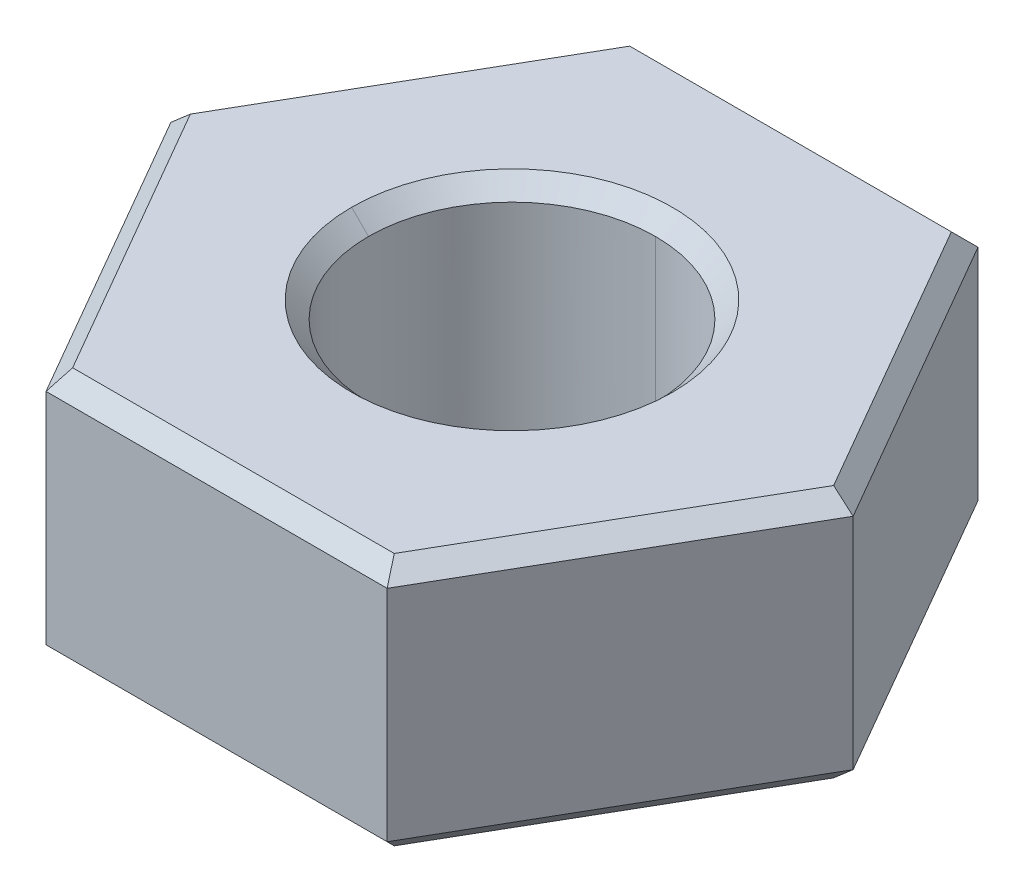
ISO-10303-21;
HEADER;
FILE_DESCRIPTION(('STEP AP214'),'2;1');
FILE_NAME('part.step','',(''),(''),'','','');
FILE_SCHEMA(('AUTOMOTIVE_DESIGN { 1 0 10303 214 1 1 1 1 }'));
ENDSEC;
DATA;
#1=APPLICATION_CONTEXT('core data for automotive mechanical design processes');
#2=APPLICATION_PROTOCOL_DEFINITION('international standard','automotive_design',2000,#1);
#3=PRODUCT_CONTEXT('',#1,'mechanical');
#4=PRODUCT('Part','Part','',(#3));
#5=PRODUCT_RELATED_PRODUCT_CATEGORY('part','',(#4));
#6=PRODUCT_DEFINITION_FORMATION('','',#4);
#7=PRODUCT_DEFINITION_CONTEXT('part definition',#1,'design');
#8=PRODUCT_DEFINITION('design','',#6,#7);
#9=PRODUCT_DEFINITION_SHAPE('','',#8);
#10=(LENGTH_UNIT() NAMED_UNIT(*) SI_UNIT(.MILLI.,.METRE.));
#11=(NAMED_UNIT(*) PLANE_ANGLE_UNIT() SI_UNIT($,.RADIAN.));
#12=(NAMED_UNIT(*) SI_UNIT($,.STERADIAN.) SOLID_ANGLE_UNIT());
#13=UNCERTAINTY_MEASURE_WITH_UNIT(LENGTH_MEASURE(1.E-05),#10,'distance_accuracy_value','');
#14=(GEOMETRIC_REPRESENTATION_CONTEXT(3) GLOBAL_UNCERTAINTY_ASSIGNED_CONTEXT((#13)) GLOBAL_UNIT_ASSIGNED_CONTEXT((#10,
#11,#12)) REPRESENTATION_CONTEXT('',''));
#15=CARTESIAN_POINT('',(0.,0.,0.));
#16=DIRECTION('',(0.,0.,1.));
#17=DIRECTION('',(1.,0.,0.));
#18=AXIS2_PLACEMENT_3D('',#15,#16,#17);
#19=CARTESIAN_POINT('',(4.04145188432738,0.,0.));
#20=DIRECTION('',(0.,1.,0.));
#21=DIRECTION('',(0.,0.,1.));
#22=AXIS2_PLACEMENT_3D('',#19,#20,#21);
#23=PLANE('',#22);
#24=CARTESIAN_POINT('',(0.,0.,0.));
#25=DIRECTION('',(0.,-1.,0.));
#26=DIRECTION('',(0.,0.,-1.));
#27=AXIS2_PLACEMENT_3D('',#24,#25,#26);
#28=CIRCLE('',#27,1.90000000003465);
#29=CARTESIAN_POINT('',(0.,0.,1.90000000003465));
#30=VERTEX_POINT('',#29);
#31=CARTESIAN_POINT('',(0.,0.,-1.90000000003465));
#32=VERTEX_POINT('',#31);
#33=EDGE_CURVE('E46',#30,#32,#28,.F.);
#34=ORIENTED_EDGE('',*,*,#33,.T.);
#35=CARTESIAN_POINT('',(0.,0.,0.));
#36=DIRECTION('',(0.,-1.,0.));
#37=DIRECTION('',(0.,0.,-1.));
#38=AXIS2_PLACEMENT_3D('',#35,#36,#37);
#39=CIRCLE('',#38,1.90000000003465);
#40=EDGE_CURVE('E20',#32,#30,#39,.F.);
#41=ORIENTED_EDGE('',*,*,#40,.T.);
#42=EDGE_LOOP('',(#34,#41));
#43=FACE_BOUND('',#42,.T.);
#44=DIRECTION('',(-0.5,0.,0.866025403784439));
#45=VECTOR('',#44,1.);
#46=CARTESIAN_POINT('',(3.81051177665153,0.,0.));
#47=LINE('',#46,#45);
#48=CARTESIAN_POINT('',(3.81051177665153,0.,0.));
#49=VERTEX_POINT('',#48);
#50=CARTESIAN_POINT('',(1.90525588832576,0.,3.3));
#51=VERTEX_POINT('',#50);
#52=EDGE_CURVE('E225',#49,#51,#47,.T.);
#53=ORIENTED_EDGE('',*,*,#52,.T.);
#54=DIRECTION('',(1.,0.,0.));
#55=VECTOR('',#54,1.);
#56=CARTESIAN_POINT('',(-2.02072594216369,0.,3.3));
#57=LINE('',#56,#55);
#58=CARTESIAN_POINT('',(-1.90525588832576,0.,3.3));
#59=VERTEX_POINT('',#58);
#60=EDGE_CURVE('E230',#51,#59,#57,.F.);
#61=ORIENTED_EDGE('',*,*,#60,.T.);
#62=DIRECTION('',(-0.5,0.,-0.866025403784439));
#63=VECTOR('',#62,1.);
#64=CARTESIAN_POINT('',(-1.90525588832576,0.,3.3));
#65=LINE('',#64,#63);
#66=CARTESIAN_POINT('',(-3.81051177665153,0.,0.));
#67=VERTEX_POINT('',#66);
#68=EDGE_CURVE('E235',#59,#67,#65,.T.);
#69=ORIENTED_EDGE('',*,*,#68,.T.);
#70=DIRECTION('',(0.5,0.,-0.866025403784439));
#71=VECTOR('',#70,1.);
#72=CARTESIAN_POINT('',(-3.81051177665153,0.,0.));
#73=LINE('',#72,#71);
#74=CARTESIAN_POINT('',(-1.90525588832576,0.,-3.3));
#75=VERTEX_POINT('',#74);
#76=EDGE_CURVE('E242',#67,#75,#73,.T.);
#77=ORIENTED_EDGE('',*,*,#76,.T.);
#78=DIRECTION('',(1.,0.,0.));
#79=VECTOR('',#78,1.);
#80=CARTESIAN_POINT('',(2.02072594216369,0.,-3.3));
#81=LINE('',#80,#79);
#82=CARTESIAN_POINT('',(1.90525588832576,0.,-3.3));
#83=VERTEX_POINT('',#82);
#84=EDGE_CURVE('E60',#75,#83,#81,.T.);
#85=ORIENTED_EDGE('',*,*,#84,.T.);
#86=DIRECTION('',(0.5,0.,0.866025403784439));
#87=VECTOR('',#86,1.);
#88=CARTESIAN_POINT('',(1.90525588832576,0.,-3.3));
#89=LINE('',#88,#87);
#90=EDGE_CURVE('E219',#83,#49,#89,.T.);
#91=ORIENTED_EDGE('',*,*,#90,.T.);
#92=EDGE_LOOP('',(#53,#61,#69,#77,#85,#91));
#93=FACE_BOUND('',#92,.T.);
#94=ADVANCED_FACE('F17',(#43,#93),#23,.F.);
#95=CARTESIAN_POINT('',(2.02072594216369,0.200000000000001,-3.5));
#96=DIRECTION('',(0.,0.707106781186551,0.707106781186544));
#97=DIRECTION('',(0.,-0.707106781186544,0.707106781186551));
#98=AXIS2_PLACEMENT_3D('',#95,#96,#97);
#99=PLANE('',#98);
#100=DIRECTION('',(-0.377964473009231,-0.654653670707974,0.654653670707978));
#101=VECTOR('',#100,1.);
#102=CARTESIAN_POINT('',(2.02072594216369,0.2,-3.5));
#103=LINE('',#102,#101);
#104=CARTESIAN_POINT('',(2.02072594216369,0.200000000000001,-3.5));
#105=VERTEX_POINT('',#104);
#106=EDGE_CURVE('E221',#105,#83,#103,.T.);
#107=ORIENTED_EDGE('',*,*,#106,.T.);
#108=ORIENTED_EDGE('',*,*,#84,.F.);
#109=DIRECTION('',(-0.377964473009228,0.654653670707975,-0.654653670707979));
#110=VECTOR('',#109,1.);
#111=CARTESIAN_POINT('',(-1.90525588832576,0.,-3.3));
#112=LINE('',#111,#110);
#113=CARTESIAN_POINT('',(-2.02072594216369,0.2,-3.5));
#114=VERTEX_POINT('',#113);
#115=EDGE_CURVE('E240',#75,#114,#112,.T.);
#116=ORIENTED_EDGE('',*,*,#115,.T.);
#117=DIRECTION('',(1.,0.,0.));
#118=VECTOR('',#117,1.);
#119=CARTESIAN_POINT('',(2.02072594216369,0.200000000000001,-3.5));
#120=LINE('',#119,#118);
#121=EDGE_CURVE('E204',#114,#105,#120,.T.);
#122=ORIENTED_EDGE('',*,*,#121,.T.);
#123=EDGE_LOOP('',(#107,#108,#116,#122));
#124=FACE_BOUND('',#123,.T.);
#125=ADVANCED_FACE('F390',(#124),#99,.F.);
#126=CARTESIAN_POINT('',(-2.02072594216369,0.200000000000001,-3.5));
#127=DIRECTION('',(0.612372435695792,0.70710678118655,0.353553390593272));
#128=DIRECTION('',(-0.755928946018457,0.654653670707974,0.));
#129=AXIS2_PLACEMENT_3D('',#126,#127,#128);
#130=PLANE('',#129);
#131=ORIENTED_EDGE('',*,*,#115,.F.);
#132=ORIENTED_EDGE('',*,*,#76,.F.);
#133=DIRECTION('',(-0.755928946018457,0.654653670707974,0.));
#134=VECTOR('',#133,1.);
#135=CARTESIAN_POINT('',(-4.04145188432738,0.200000000000001,0.));
#136=LINE('',#135,#134);
#137=CARTESIAN_POINT('',(-4.04145188432738,0.200000000000001,0.));
#138=VERTEX_POINT('',#137);
#139=EDGE_CURVE('E238',#67,#138,#136,.T.);
#140=ORIENTED_EDGE('',*,*,#139,.T.);
#141=DIRECTION('',(0.5,0.,-0.866025403784439));
#142=VECTOR('',#141,1.);
#143=CARTESIAN_POINT('',(-2.02072594216369,0.200000000000001,-3.5));
#144=LINE('',#143,#142);
#145=EDGE_CURVE('E200',#138,#114,#144,.T.);
#146=ORIENTED_EDGE('',*,*,#145,.T.);
#147=EDGE_LOOP('',(#131,#132,#140,#146));
#148=FACE_BOUND('',#147,.T.);
#149=ADVANCED_FACE('F391',(#148),#130,.F.);
#150=CARTESIAN_POINT('',(-4.04145188432738,0.200000000000001,0.));
#151=DIRECTION('',(0.612372435695792,0.707106781186551,-0.353553390593272));
#152=DIRECTION('',(-0.755928946018457,0.654653670707974,0.));
#153=AXIS2_PLACEMENT_3D('',#150,#151,#152);
#154=PLANE('',#153);
#155=DIRECTION('',(-0.377964473009229,0.654653670707973,0.65465367070798));
#156=VECTOR('',#155,1.);
#157=CARTESIAN_POINT('',(-1.90525588832576,0.,3.3));
#158=LINE('',#157,#156);
#159=CARTESIAN_POINT('',(-2.02072594216369,0.2,3.5));
#160=VERTEX_POINT('',#159);
#161=EDGE_CURVE('E233',#59,#160,#158,.T.);
#162=ORIENTED_EDGE('',*,*,#161,.T.);
#163=DIRECTION('',(-0.5,0.,-0.866025403784439));
#164=VECTOR('',#163,1.);
#165=CARTESIAN_POINT('',(-4.04145188432738,0.2,0.));
#166=LINE('',#165,#164);
#167=EDGE_CURVE('E195',#160,#138,#166,.T.);
#168=ORIENTED_EDGE('',*,*,#167,.T.);
#169=ORIENTED_EDGE('',*,*,#139,.F.);
#170=ORIENTED_EDGE('',*,*,#68,.F.);
#171=EDGE_LOOP('',(#162,#168,#169,#170));
#172=FACE_BOUND('',#171,.T.);
#173=ADVANCED_FACE('F362',(#172),#154,.F.);
#174=CARTESIAN_POINT('',(-2.02072594216369,0.200000000000001,3.5));
#175=DIRECTION('',(0.,0.707106781186551,-0.707106781186544));
#176=DIRECTION('',(0.,0.707106781186544,0.707106781186551));
#177=AXIS2_PLACEMENT_3D('',#174,#175,#176);
#178=PLANE('',#177);
#179=DIRECTION('',(0.37796447300923,0.654653670707973,0.65465367070798));
#180=VECTOR('',#179,1.);
#181=CARTESIAN_POINT('',(1.90525588832576,0.,3.3));
#182=LINE('',#181,#180);
#183=CARTESIAN_POINT('',(2.02072594216369,0.200000000000001,3.5));
#184=VERTEX_POINT('',#183);
#185=EDGE_CURVE('E228',#51,#184,#182,.T.);
#186=ORIENTED_EDGE('',*,*,#185,.T.);
#187=DIRECTION('',(-1.,0.,0.));
#188=VECTOR('',#187,1.);
#189=CARTESIAN_POINT('',(-2.02072594216369,0.200000000000001,3.5));
#190=LINE('',#189,#188);
#191=EDGE_CURVE('E189',#184,#160,#190,.T.);
#192=ORIENTED_EDGE('',*,*,#191,.T.);
#193=ORIENTED_EDGE('',*,*,#161,.F.);
#194=ORIENTED_EDGE('',*,*,#60,.F.);
#195=EDGE_LOOP('',(#186,#192,#193,#194));
#196=FACE_BOUND('',#195,.T.);
#197=ADVANCED_FACE('F365',(#196),#178,.F.);
#198=CARTESIAN_POINT('',(2.02072594216369,0.200000000000001,3.5));
#199=DIRECTION('',(-0.612372435695791,0.707106781186552,-0.353553390593271));
#200=DIRECTION('',(-0.755928946018458,-0.654653670707973,0.));
#201=AXIS2_PLACEMENT_3D('',#198,#199,#200);
#202=PLANE('',#201);
#203=DIRECTION('',(-0.755928946018458,-0.654653670707974,0.));
#204=VECTOR('',#203,1.);
#205=CARTESIAN_POINT('',(4.04145188432738,0.200000000000001,0.));
#206=LINE('',#205,#204);
#207=CARTESIAN_POINT('',(4.04145188432738,0.200000000000001,0.));
#208=VERTEX_POINT('',#207);
#209=EDGE_CURVE('E223',#49,#208,#206,.F.);
#210=ORIENTED_EDGE('',*,*,#209,.T.);
#211=DIRECTION('',(-0.5,0.,0.866025403784439));
#212=VECTOR('',#211,1.);
#213=CARTESIAN_POINT('',(2.02072594216369,0.200000000000001,3.5));
#214=LINE('',#213,#212);
#215=EDGE_CURVE('E183',#208,#184,#214,.T.);
#216=ORIENTED_EDGE('',*,*,#215,.T.);
#217=ORIENTED_EDGE('',*,*,#185,.F.);
#218=ORIENTED_EDGE('',*,*,#52,.F.);
#219=EDGE_LOOP('',(#210,#216,#217,#218));
#220=FACE_BOUND('',#219,.T.);
#221=ADVANCED_FACE('F369',(#220),#202,.F.);
#222=CARTESIAN_POINT('',(4.04145188432738,0.200000000000001,0.));
#223=DIRECTION('',(-0.612372435695792,0.707106781186551,0.353553390593272));
#224=DIRECTION('',(-0.755928946018458,-0.654653670707974,0.));
#225=AXIS2_PLACEMENT_3D('',#222,#223,#224);
#226=PLANE('',#225);
#227=ORIENTED_EDGE('',*,*,#106,.F.);
#228=DIRECTION('',(0.5,0.,0.866025403784438));
#229=VECTOR('',#228,1.);
#230=CARTESIAN_POINT('',(4.04145188432738,0.200000000000001,0.));
#231=LINE('',#230,#229);
#232=EDGE_CURVE('E173',#105,#208,#231,.T.);
#233=ORIENTED_EDGE('',*,*,#232,.T.);
#234=ORIENTED_EDGE('',*,*,#209,.F.);
#235=ORIENTED_EDGE('',*,*,#90,.F.);
#236=EDGE_LOOP('',(#227,#233,#234,#235));
#237=FACE_BOUND('',#236,.T.);
#238=ADVANCED_FACE('F388',(#237),#226,.F.);
#239=CARTESIAN_POINT('',(0.,0.,0.));
#240=DIRECTION('',(0.,-1.,0.));
#241=DIRECTION('',(0.,0.,-1.));
#242=AXIS2_PLACEMENT_3D('',#239,#240,#241);
#243=CONICAL_SURFACE('',#242,1.90000000003465,0.785398163539557);
#244=DIRECTION('',(0.,0.707106781186548,-0.707106781186547));
#245=VECTOR('',#244,1.);
#246=CARTESIAN_POINT('',(6.11098752774529E-11,-498998.1,499000.));
#247=LINE('',#246,#245);
#248=CARTESIAN_POINT('',(0.,0.200000000001662,1.69999999999279));
#249=VERTEX_POINT('',#248);
#250=EDGE_CURVE('E206',#249,#30,#247,.F.);
#251=ORIENTED_EDGE('',*,*,#250,.T.);
#252=ORIENTED_EDGE('',*,*,#40,.F.);
#253=DIRECTION('',(0.,0.707106781186548,0.707106781186547));
#254=VECTOR('',#253,1.);
#255=CARTESIAN_POINT('',(0.,-498998.1,-499000.));
#256=LINE('',#255,#254);
#257=CARTESIAN_POINT('',(0.,0.200000000001662,-1.69999999999279));
#258=VERTEX_POINT('',#257);
#259=EDGE_CURVE('E87',#32,#258,#256,.T.);
#260=ORIENTED_EDGE('',*,*,#259,.T.);
#261=CARTESIAN_POINT('',(0.,0.200000000000002,0.));
#262=DIRECTION('',(0.,-1.,0.));
#263=DIRECTION('',(0.,0.,-1.));
#264=AXIS2_PLACEMENT_3D('',#261,#262,#263);
#265=CIRCLE('',#264,1.7);
#266=EDGE_CURVE('E176',#258,#249,#265,.F.);
#267=ORIENTED_EDGE('',*,*,#266,.T.);
#268=EDGE_LOOP('',(#251,#252,#260,#267));
#269=FACE_BOUND('',#268,.T.);
#270=ADVANCED_FACE('F410',(#269),#243,.F.);
#271=CARTESIAN_POINT('',(0.,0.,0.));
#272=DIRECTION('',(0.,-1.,0.));
#273=DIRECTION('',(0.,0.,-1.));
#274=AXIS2_PLACEMENT_3D('',#271,#272,#273);
#275=CONICAL_SURFACE('',#274,1.90000000003465,0.785398163539557);
#276=CARTESIAN_POINT('',(0.,0.200000000000002,0.));
#277=DIRECTION('',(0.,-1.,0.));
#278=DIRECTION('',(0.,0.,-1.));
#279=AXIS2_PLACEMENT_3D('',#276,#277,#278);
#280=CIRCLE('',#279,1.7);
#281=EDGE_CURVE('E147',#249,#258,#280,.F.);
#282=ORIENTED_EDGE('',*,*,#281,.T.);
#283=ORIENTED_EDGE('',*,*,#259,.F.);
#284=ORIENTED_EDGE('',*,*,#33,.F.);
#285=ORIENTED_EDGE('',*,*,#250,.F.);
#286=EDGE_LOOP('',(#282,#283,#284,#285));
#287=FACE_BOUND('',#286,.T.);
#288=ADVANCED_FACE('F413',(#287),#275,.F.);
#289=CARTESIAN_POINT('',(2.02072594216369,3.,-3.5));
#290=DIRECTION('',(0.,0.,1.));
#291=DIRECTION('',(1.,0.,0.));
#292=AXIS2_PLACEMENT_3D('',#289,#290,#291);
#293=PLANE('',#292);
#294=DIRECTION('',(0.,1.,0.));
#295=VECTOR('',#294,1.);
#296=CARTESIAN_POINT('',(-2.02072594216369,3.,-3.5));
#297=LINE('',#296,#295);
#298=CARTESIAN_POINT('',(-2.02072594216369,2.8,-3.5));
#299=VERTEX_POINT('',#298);
#300=EDGE_CURVE('E96',#114,#299,#297,.T.);
#301=ORIENTED_EDGE('',*,*,#300,.T.);
#302=DIRECTION('',(1.,0.,0.));
#303=VECTOR('',#302,1.);
#304=CARTESIAN_POINT('',(4.04145188432738,2.8,-3.5));
#305=LINE('',#304,#303);
#306=CARTESIAN_POINT('',(2.02072594216369,2.8,-3.5));
#307=VERTEX_POINT('',#306);
#308=EDGE_CURVE('E148',#307,#299,#305,.F.);
#309=ORIENTED_EDGE('',*,*,#308,.F.);
#310=DIRECTION('',(0.,1.,0.));
#311=VECTOR('',#310,1.);
#312=CARTESIAN_POINT('',(2.02072594216369,3.,-3.5));
#313=LINE('',#312,#311);
#314=EDGE_CURVE('E177',#307,#105,#313,.F.);
#315=ORIENTED_EDGE('',*,*,#314,.T.);
#316=ORIENTED_EDGE('',*,*,#121,.F.);
#317=EDGE_LOOP('',(#301,#309,#315,#316));
#318=FACE_BOUND('',#317,.T.);
#319=ADVANCED_FACE('F384',(#318),#293,.F.);
#320=CARTESIAN_POINT('',(-2.02072594216369,3.,-3.5));
#321=DIRECTION('',(0.866025403784439,0.,0.5));
#322=DIRECTION('',(0.5,0.,-0.866025403784439));
#323=AXIS2_PLACEMENT_3D('',#320,#321,#322);
#324=PLANE('',#323);
#325=DIRECTION('',(0.,1.,0.));
#326=VECTOR('',#325,1.);
#327=CARTESIAN_POINT('',(-4.04145188432738,3.,0.));
#328=LINE('',#327,#326);
#329=CARTESIAN_POINT('',(-4.04145188432738,2.8,0.));
#330=VERTEX_POINT('',#329);
#331=EDGE_CURVE('E198',#138,#330,#328,.T.);
#332=ORIENTED_EDGE('',*,*,#331,.T.);
#333=DIRECTION('',(-0.5,0.,0.866025403784439));
#334=VECTOR('',#333,1.);
#335=CARTESIAN_POINT('',(-2.02072594216369,2.8,-3.5));
#336=LINE('',#335,#334);
#337=EDGE_CURVE('E298',#299,#330,#336,.T.);
#338=ORIENTED_EDGE('',*,*,#337,.F.);
#339=ORIENTED_EDGE('',*,*,#300,.F.);
#340=ORIENTED_EDGE('',*,*,#145,.F.);
#341=EDGE_LOOP('',(#332,#338,#339,#340));
#342=FACE_BOUND('',#341,.T.);
#343=ADVANCED_FACE('F356',(#342),#324,.F.);
#344=CARTESIAN_POINT('',(-4.04145188432738,3.,0.));
#345=DIRECTION('',(0.866025403784439,0.,-0.5));
#346=DIRECTION('',(-0.5,0.,-0.866025403784439));
#347=AXIS2_PLACEMENT_3D('',#344,#345,#346);
#348=PLANE('',#347);
#349=DIRECTION('',(0.,1.,0.));
#350=VECTOR('',#349,1.);
#351=CARTESIAN_POINT('',(-2.02072594216369,3.,3.5));
#352=LINE('',#351,#350);
#353=CARTESIAN_POINT('',(-2.02072594216369,2.8,3.5));
#354=VERTEX_POINT('',#353);
#355=EDGE_CURVE('E192',#160,#354,#352,.T.);
#356=ORIENTED_EDGE('',*,*,#355,.T.);
#357=DIRECTION('',(0.5,0.,0.866025403784438));
#358=VECTOR('',#357,1.);
#359=CARTESIAN_POINT('',(-4.04145188432738,2.8,0.));
#360=LINE('',#359,#358);
#361=EDGE_CURVE('E292',#330,#354,#360,.T.);
#362=ORIENTED_EDGE('',*,*,#361,.F.);
#363=ORIENTED_EDGE('',*,*,#331,.F.);
#364=ORIENTED_EDGE('',*,*,#167,.F.);
#365=EDGE_LOOP('',(#356,#362,#363,#364));
#366=FACE_BOUND('',#365,.T.);
#367=ADVANCED_FACE('F339',(#366),#348,.F.);
#368=CARTESIAN_POINT('',(-2.02072594216369,3.,3.5));
#369=DIRECTION('',(0.,0.,-1.));
#370=DIRECTION('',(-1.,0.,0.));
#371=AXIS2_PLACEMENT_3D('',#368,#369,#370);
#372=PLANE('',#371);
#373=DIRECTION('',(0.,1.,0.));
#374=VECTOR('',#373,1.);
#375=CARTESIAN_POINT('',(2.02072594216369,3.,3.5));
#376=LINE('',#375,#374);
#377=CARTESIAN_POINT('',(2.02072594216369,2.8,3.5));
#378=VERTEX_POINT('',#377);
#379=EDGE_CURVE('E186',#184,#378,#376,.T.);
#380=ORIENTED_EDGE('',*,*,#379,.T.);
#381=DIRECTION('',(1.,0.,0.));
#382=VECTOR('',#381,1.);
#383=CARTESIAN_POINT('',(4.04145188432738,2.8,3.5));
#384=LINE('',#383,#382);
#385=EDGE_CURVE('E286',#354,#378,#384,.T.);
#386=ORIENTED_EDGE('',*,*,#385,.F.);
#387=ORIENTED_EDGE('',*,*,#355,.F.);
#388=ORIENTED_EDGE('',*,*,#191,.F.);
#389=EDGE_LOOP('',(#380,#386,#387,#388));
#390=FACE_BOUND('',#389,.T.);
#391=ADVANCED_FACE('F347',(#390),#372,.F.);
#392=CARTESIAN_POINT('',(2.02072594216369,3.,3.5));
#393=DIRECTION('',(-0.866025403784439,0.,-0.5));
#394=DIRECTION('',(-0.5,0.,0.866025403784439));
#395=AXIS2_PLACEMENT_3D('',#392,#393,#394);
#396=PLANE('',#395);
#397=DIRECTION('',(0.,1.,0.));
#398=VECTOR('',#397,1.);
#399=CARTESIAN_POINT('',(4.04145188432738,3.,0.));
#400=LINE('',#399,#398);
#401=CARTESIAN_POINT('',(4.04145188432738,2.8,0.));
#402=VERTEX_POINT('',#401);
#403=EDGE_CURVE('E180',#208,#402,#400,.T.);
#404=ORIENTED_EDGE('',*,*,#403,.T.);
#405=DIRECTION('',(0.5,0.,-0.866025403784439));
#406=VECTOR('',#405,1.);
#407=CARTESIAN_POINT('',(2.02072594216369,2.8,3.5));
#408=LINE('',#407,#406);
#409=EDGE_CURVE('E280',#378,#402,#408,.T.);
#410=ORIENTED_EDGE('',*,*,#409,.F.);
#411=ORIENTED_EDGE('',*,*,#379,.F.);
#412=ORIENTED_EDGE('',*,*,#215,.F.);
#413=EDGE_LOOP('',(#404,#410,#411,#412));
#414=FACE_BOUND('',#413,.T.);
#415=ADVANCED_FACE('F372',(#414),#396,.F.);
#416=CARTESIAN_POINT('',(4.04145188432738,3.,0.));
#417=DIRECTION('',(-0.866025403784438,0.,0.5));
#418=DIRECTION('',(0.5,0.,0.866025403784438));
#419=AXIS2_PLACEMENT_3D('',#416,#417,#418);
#420=PLANE('',#419);
#421=ORIENTED_EDGE('',*,*,#314,.F.);
#422=DIRECTION('',(-0.5,0.,-0.866025403784438));
#423=VECTOR('',#422,1.);
#424=CARTESIAN_POINT('',(4.04145188432738,2.8,0.));
#425=LINE('',#424,#423);
#426=EDGE_CURVE('E274',#402,#307,#425,.T.);
#427=ORIENTED_EDGE('',*,*,#426,.F.);
#428=ORIENTED_EDGE('',*,*,#403,.F.);
#429=ORIENTED_EDGE('',*,*,#232,.F.);
#430=EDGE_LOOP('',(#421,#427,#428,#429));
#431=FACE_BOUND('',#430,.T.);
#432=ADVANCED_FACE('F377',(#431),#420,.F.);
#433=CARTESIAN_POINT('',(0.,3.,0.));
#434=DIRECTION('',(0.,-1.,0.));
#435=DIRECTION('',(0.,0.,-1.));
#436=AXIS2_PLACEMENT_3D('',#433,#434,#435);
#437=CYLINDRICAL_SURFACE('',#436,1.7);
#438=CARTESIAN_POINT('',(0.,2.80000000003611,0.));
#439=DIRECTION('',(0.,1.,0.));
#440=DIRECTION('',(-1.,0.,0.));
#441=AXIS2_PLACEMENT_3D('',#438,#439,#440);
#442=CIRCLE('',#441,1.70000000002801);
#443=CARTESIAN_POINT('',(-1.70000000002801,2.80000000003611,0.));
#444=VERTEX_POINT('',#443);
#445=CARTESIAN_POINT('',(0.,2.80000000003611,1.70000000001868));
#446=VERTEX_POINT('',#445);
#447=EDGE_CURVE('E127',#444,#446,#442,.T.);
#448=ORIENTED_EDGE('',*,*,#447,.T.);
#449=DIRECTION('',(0.,-1.,0.));
#450=VECTOR('',#449,1.);
#451=CARTESIAN_POINT('',(0.,3.,1.7));
#452=LINE('',#451,#450);
#453=EDGE_CURVE('E131',#446,#249,#452,.T.);
#454=ORIENTED_EDGE('',*,*,#453,.T.);
#455=ORIENTED_EDGE('',*,*,#266,.F.);
#456=DIRECTION('',(0.,-1.,0.));
#457=VECTOR('',#456,1.);
#458=CARTESIAN_POINT('',(0.,3.,-1.7));
#459=LINE('',#458,#457);
#460=CARTESIAN_POINT('',(0.,2.80000000003611,-1.70000000001868));
#461=VERTEX_POINT('',#460);
#462=EDGE_CURVE('E149',#258,#461,#459,.F.);
#463=ORIENTED_EDGE('',*,*,#462,.T.);
#464=CARTESIAN_POINT('',(0.,2.80000000003611,0.));
#465=DIRECTION('',(0.,1.,0.));
#466=DIRECTION('',(-1.,0.,0.));
#467=AXIS2_PLACEMENT_3D('',#464,#465,#466);
#468=CIRCLE('',#467,1.70000000002801);
#469=EDGE_CURVE('E135',#461,#444,#468,.T.);
#470=ORIENTED_EDGE('',*,*,#469,.T.);
#471=EDGE_LOOP('',(#448,#454,#455,#463,#470));
#472=FACE_BOUND('',#471,.T.);
#473=ADVANCED_FACE('F129',(#472),#437,.F.);
#474=CARTESIAN_POINT('',(0.,3.,0.));
#475=DIRECTION('',(0.,-1.,0.));
#476=DIRECTION('',(0.,0.,-1.));
#477=AXIS2_PLACEMENT_3D('',#474,#475,#476);
#478=CYLINDRICAL_SURFACE('',#477,1.7);
#479=CARTESIAN_POINT('',(0.,2.80000000003611,0.));
#480=DIRECTION('',(0.,1.,0.));
#481=DIRECTION('',(-1.,0.,0.));
#482=AXIS2_PLACEMENT_3D('',#479,#480,#481);
#483=CIRCLE('',#482,1.70000000002801);
#484=CARTESIAN_POINT('',(1.70000000006591,2.80000000005505,0.));
#485=VERTEX_POINT('',#484);
#486=EDGE_CURVE('E140',#446,#485,#483,.T.);
#487=ORIENTED_EDGE('',*,*,#486,.T.);
#488=CARTESIAN_POINT('',(0.,2.80000000003611,0.));
#489=DIRECTION('',(0.,1.,0.));
#490=DIRECTION('',(-1.,0.,0.));
#491=AXIS2_PLACEMENT_3D('',#488,#489,#490);
#492=CIRCLE('',#491,1.70000000002801);
#493=EDGE_CURVE('E166',#485,#461,#492,.T.);
#494=ORIENTED_EDGE('',*,*,#493,.T.);
#495=ORIENTED_EDGE('',*,*,#462,.F.);
#496=ORIENTED_EDGE('',*,*,#281,.F.);
#497=ORIENTED_EDGE('',*,*,#453,.F.);
#498=EDGE_LOOP('',(#487,#494,#495,#496,#497));
#499=FACE_BOUND('',#498,.T.);
#500=ADVANCED_FACE('F144',(#499),#478,.F.);
#501=CARTESIAN_POINT('',(4.04145188432738,3.,-3.3));
#502=DIRECTION('',(0.,0.707106781186545,-0.70710678118655));
#503=DIRECTION('',(0.,0.70710678118655,0.707106781186545));
#504=AXIS2_PLACEMENT_3D('',#501,#502,#503);
#505=PLANE('',#504);
#506=DIRECTION('',(-0.377964473009227,0.65465367070798,0.654653670707974));
#507=VECTOR('',#506,1.);
#508=CARTESIAN_POINT('',(2.02072594216369,2.8,-3.5));
#509=LINE('',#508,#507);
#510=CARTESIAN_POINT('',(1.90525588832577,3.,-3.3));
#511=VERTEX_POINT('',#510);
#512=EDGE_CURVE('E167',#307,#511,#509,.T.);
#513=ORIENTED_EDGE('',*,*,#512,.F.);
#514=ORIENTED_EDGE('',*,*,#308,.T.);
#515=DIRECTION('',(-0.377964473009223,-0.654653670707979,-0.654653670707978));
#516=VECTOR('',#515,1.);
#517=CARTESIAN_POINT('',(-1.90525588832577,3.,-3.3));
#518=LINE('',#517,#516);
#519=CARTESIAN_POINT('',(-1.90525588832577,3.,-3.3));
#520=VERTEX_POINT('',#519);
#521=EDGE_CURVE('E301',#520,#299,#518,.T.);
#522=ORIENTED_EDGE('',*,*,#521,.F.);
#523=DIRECTION('',(1.,0.,0.));
#524=VECTOR('',#523,1.);
#525=CARTESIAN_POINT('',(4.04145188432738,3.,-3.3));
#526=LINE('',#525,#524);
#527=EDGE_CURVE('E153',#511,#520,#526,.F.);
#528=ORIENTED_EDGE('',*,*,#527,.F.);
#529=EDGE_LOOP('',(#513,#514,#522,#528));
#530=FACE_BOUND('',#529,.T.);
#531=ADVANCED_FACE('F383',(#530),#505,.T.);
#532=CARTESIAN_POINT('',(-1.8475208614068,3.,-3.4));
#533=DIRECTION('',(-0.612372435695797,0.707106781186544,-0.353553390593275));
#534=DIRECTION('',(-0.755928946018452,-0.654653670707981,0.));
#535=AXIS2_PLACEMENT_3D('',#532,#533,#534);
#536=PLANE('',#535);
#537=ORIENTED_EDGE('',*,*,#521,.T.);
#538=ORIENTED_EDGE('',*,*,#337,.T.);
#539=DIRECTION('',(-0.75592894601845,-0.654653670707982,0.));
#540=VECTOR('',#539,1.);
#541=CARTESIAN_POINT('',(-2.68880268222599,3.97142857142857,0.));
#542=LINE('',#541,#540);
#543=CARTESIAN_POINT('',(-3.81051177665153,3.,0.));
#544=VERTEX_POINT('',#543);
#545=EDGE_CURVE('E295',#544,#330,#542,.T.);
#546=ORIENTED_EDGE('',*,*,#545,.F.);
#547=DIRECTION('',(-0.5,0.,0.866025403784439));
#548=VECTOR('',#547,1.);
#549=CARTESIAN_POINT('',(-1.90525588832577,3.,-3.3));
#550=LINE('',#549,#548);
#551=EDGE_CURVE('E263',#520,#544,#550,.T.);
#552=ORIENTED_EDGE('',*,*,#551,.F.);
#553=EDGE_LOOP('',(#537,#538,#546,#552));
#554=FACE_BOUND('',#553,.T.);
#555=ADVANCED_FACE('F353',(#554),#536,.T.);
#556=CARTESIAN_POINT('',(-1.8475208614068,3.,3.4));
#557=DIRECTION('',(-0.612372435695798,0.707106781186543,0.353553390593276));
#558=DIRECTION('',(-0.75592894601845,-0.654653670707982,0.));
#559=AXIS2_PLACEMENT_3D('',#556,#557,#558);
#560=PLANE('',#559);
#561=ORIENTED_EDGE('',*,*,#545,.T.);
#562=ORIENTED_EDGE('',*,*,#361,.T.);
#563=DIRECTION('',(-0.37796447300922,-0.654653670707981,0.654653670707978));
#564=VECTOR('',#563,1.);
#565=CARTESIAN_POINT('',(-1.90525588832577,3.,3.3));
#566=LINE('',#565,#564);
#567=CARTESIAN_POINT('',(-1.90525588832577,3.,3.3));
#568=VERTEX_POINT('',#567);
#569=EDGE_CURVE('E289',#568,#354,#566,.T.);
#570=ORIENTED_EDGE('',*,*,#569,.F.);
#571=DIRECTION('',(0.5,0.,0.866025403784439));
#572=VECTOR('',#571,1.);
#573=CARTESIAN_POINT('',(-3.81051177665153,3.,0.));
#574=LINE('',#573,#572);
#575=EDGE_CURVE('E260',#544,#568,#574,.T.);
#576=ORIENTED_EDGE('',*,*,#575,.F.);
#577=EDGE_LOOP('',(#561,#562,#570,#576));
#578=FACE_BOUND('',#577,.T.);
#579=ADVANCED_FACE('F345',(#578),#560,.T.);
#580=CARTESIAN_POINT('',(4.04145188432738,3.,3.3));
#581=DIRECTION('',(0.,0.707106781186545,0.70710678118655));
#582=DIRECTION('',(0.,-0.70710678118655,0.707106781186545));
#583=AXIS2_PLACEMENT_3D('',#580,#581,#582);
#584=PLANE('',#583);
#585=ORIENTED_EDGE('',*,*,#569,.T.);
#586=ORIENTED_EDGE('',*,*,#385,.T.);
#587=DIRECTION('',(0.377964473009229,-0.654653670707981,0.654653670707972));
#588=VECTOR('',#587,1.);
#589=CARTESIAN_POINT('',(1.90525588832577,3.,3.3));
#590=LINE('',#589,#588);
#591=CARTESIAN_POINT('',(1.90525588832577,3.,3.3));
#592=VERTEX_POINT('',#591);
#593=EDGE_CURVE('E283',#592,#378,#590,.T.);
#594=ORIENTED_EDGE('',*,*,#593,.F.);
#595=DIRECTION('',(1.,0.,0.));
#596=VECTOR('',#595,1.);
#597=CARTESIAN_POINT('',(4.04145188432738,3.,3.3));
#598=LINE('',#597,#596);
#599=EDGE_CURVE('E255',#568,#592,#598,.T.);
#600=ORIENTED_EDGE('',*,*,#599,.F.);
#601=EDGE_LOOP('',(#585,#586,#594,#600));
#602=FACE_BOUND('',#601,.T.);
#603=ADVANCED_FACE('F350',(#602),#584,.T.);
#604=CARTESIAN_POINT('',(3.8682468035705,3.,-0.0999999999999997));
#605=DIRECTION('',(0.612372435695797,0.707106781186545,0.353553390593275));
#606=DIRECTION('',(-0.755928946018452,0.65465367070798,0.));
#607=AXIS2_PLACEMENT_3D('',#604,#605,#606);
#608=PLANE('',#607);
#609=DIRECTION('',(-0.755928946018452,0.65465367070798,0.));
#610=VECTOR('',#609,1.);
#611=CARTESIAN_POINT('',(3.84350322060522,2.97142857142857,0.));
#612=LINE('',#611,#610);
#613=CARTESIAN_POINT('',(3.81051177665153,3.,0.));
#614=VERTEX_POINT('',#613);
#615=EDGE_CURVE('E277',#614,#402,#612,.F.);
#616=ORIENTED_EDGE('',*,*,#615,.F.);
#617=DIRECTION('',(0.5,0.,-0.866025403784439));
#618=VECTOR('',#617,1.);
#619=CARTESIAN_POINT('',(1.90525588832577,3.,3.3));
#620=LINE('',#619,#618);
#621=EDGE_CURVE('E249',#592,#614,#620,.T.);
#622=ORIENTED_EDGE('',*,*,#621,.F.);
#623=ORIENTED_EDGE('',*,*,#593,.T.);
#624=ORIENTED_EDGE('',*,*,#409,.T.);
#625=EDGE_LOOP('',(#616,#622,#623,#624));
#626=FACE_BOUND('',#625,.T.);
#627=ADVANCED_FACE('F315',(#626),#608,.T.);
#628=CARTESIAN_POINT('',(3.86824680357049,3.,0.0999999999999978));
#629=DIRECTION('',(0.612372435695796,0.707106781186545,-0.353553390593275));
#630=DIRECTION('',(-0.755928946018452,0.65465367070798,0.));
#631=AXIS2_PLACEMENT_3D('',#628,#629,#630);
#632=PLANE('',#631);
#633=ORIENTED_EDGE('',*,*,#512,.T.);
#634=DIRECTION('',(-0.5,0.,-0.866025403784438));
#635=VECTOR('',#634,1.);
#636=CARTESIAN_POINT('',(3.81051177665153,3.,0.));
#637=LINE('',#636,#635);
#638=EDGE_CURVE('E246',#614,#511,#637,.T.);
#639=ORIENTED_EDGE('',*,*,#638,.F.);
#640=ORIENTED_EDGE('',*,*,#615,.T.);
#641=ORIENTED_EDGE('',*,*,#426,.T.);
#642=EDGE_LOOP('',(#633,#639,#640,#641));
#643=FACE_BOUND('',#642,.T.);
#644=ADVANCED_FACE('F381',(#643),#632,.T.);
#645=CARTESIAN_POINT('',(0.,3.00000000004275,0.));
#646=DIRECTION('',(0.,1.,0.));
#647=DIRECTION('',(0.,0.,1.));
#648=AXIS2_PLACEMENT_3D('',#645,#646,#647);
#649=CONICAL_SURFACE('',#648,1.9000000000915,0.785398163539557);
#650=DIRECTION('',(-0.707106781186548,-0.707106781186547,0.));
#651=VECTOR('',#650,1.);
#652=CARTESIAN_POINT('',(498998.9,499000.,6.1109740566305E-11));
#653=LINE('',#652,#651);
#654=CARTESIAN_POINT('',(1.90000000006307,2.9999999999859,0.));
#655=VERTEX_POINT('',#654);
#656=EDGE_CURVE('E35',#485,#655,#653,.F.);
#657=ORIENTED_EDGE('',*,*,#656,.T.);
#658=CARTESIAN_POINT('',(0.,2.99999999992906,0.));
#659=DIRECTION('',(0.,1.,0.));
#660=DIRECTION('',(0.,0.,1.));
#661=AXIS2_PLACEMENT_3D('',#658,#659,#660);
#662=CIRCLE('',#661,1.89999999997781);
#663=CARTESIAN_POINT('',(-1.90000000000623,2.99999999995748,0.));
#664=VERTEX_POINT('',#663);
#665=EDGE_CURVE('E26',#664,#655,#662,.F.);
#666=ORIENTED_EDGE('',*,*,#665,.F.);
#667=DIRECTION('',(0.707106781186547,-0.707106781186548,0.));
#668=VECTOR('',#667,1.);
#669=CARTESIAN_POINT('',(-498998.9,499000.,0.));
#670=LINE('',#669,#668);
#671=EDGE_CURVE('E141',#664,#444,#670,.T.);
#672=ORIENTED_EDGE('',*,*,#671,.T.);
#673=ORIENTED_EDGE('',*,*,#469,.F.);
#674=ORIENTED_EDGE('',*,*,#493,.F.);
#675=EDGE_LOOP('',(#657,#666,#672,#673,#674));
#676=FACE_BOUND('',#675,.T.);
#677=ADVANCED_FACE('F305',(#676),#649,.F.);
#678=CARTESIAN_POINT('',(0.,3.00000000004275,0.));
#679=DIRECTION('',(0.,1.,0.));
#680=DIRECTION('',(0.,0.,1.));
#681=AXIS2_PLACEMENT_3D('',#678,#679,#680);
#682=CONICAL_SURFACE('',#681,1.9000000000915,0.785398163539557);
#683=ORIENTED_EDGE('',*,*,#486,.F.);
#684=ORIENTED_EDGE('',*,*,#447,.F.);
#685=ORIENTED_EDGE('',*,*,#671,.F.);
#686=CARTESIAN_POINT('',(0.,3.00000000004275,0.));
#687=DIRECTION('',(0.,1.,0.));
#688=DIRECTION('',(0.,0.,1.));
#689=AXIS2_PLACEMENT_3D('',#686,#687,#688);
#690=CIRCLE('',#689,1.9000000000915);
#691=EDGE_CURVE('E11',#655,#664,#690,.F.);
#692=ORIENTED_EDGE('',*,*,#691,.F.);
#693=ORIENTED_EDGE('',*,*,#656,.F.);
#694=EDGE_LOOP('',(#683,#684,#685,#692,#693));
#695=FACE_BOUND('',#694,.T.);
#696=ADVANCED_FACE('F151',(#695),#682,.F.);
#697=CARTESIAN_POINT('',(4.04145188432738,3.,0.));
#698=DIRECTION('',(0.,1.,0.));
#699=DIRECTION('',(0.,0.,1.));
#700=AXIS2_PLACEMENT_3D('',#697,#698,#699);
#701=PLANE('',#700);
#702=ORIENTED_EDGE('',*,*,#665,.T.);
#703=ORIENTED_EDGE('',*,*,#691,.T.);
#704=EDGE_LOOP('',(#702,#703));
#705=FACE_BOUND('',#704,.T.);
#706=ORIENTED_EDGE('',*,*,#621,.T.);
#707=ORIENTED_EDGE('',*,*,#638,.T.);
#708=ORIENTED_EDGE('',*,*,#527,.T.);
#709=ORIENTED_EDGE('',*,*,#551,.T.);
#710=ORIENTED_EDGE('',*,*,#575,.T.);
#711=ORIENTED_EDGE('',*,*,#599,.T.);
#712=EDGE_LOOP('',(#706,#707,#708,#709,#710,#711));
#713=FACE_BOUND('',#712,.T.);
#714=ADVANCED_FACE('F306',(#705,#713),#701,.T.);
#715=CLOSED_SHELL('',(#94,#125,#149,#173,#197,#221,#238,#270,#288,#319,#343,#367,#391,#415,#432,
#473,#500,#531,#555,#579,#603,#627,#644,#677,#696,#714));
#716=MANIFOLD_SOLID_BREP('B1',#715);
#717=ADVANCED_BREP_SHAPE_REPRESENTATION('',(#18,#716),#14);
#718=SHAPE_DEFINITION_REPRESENTATION(#9,#717);
ENDSEC;
END-ISO-10303-21;
